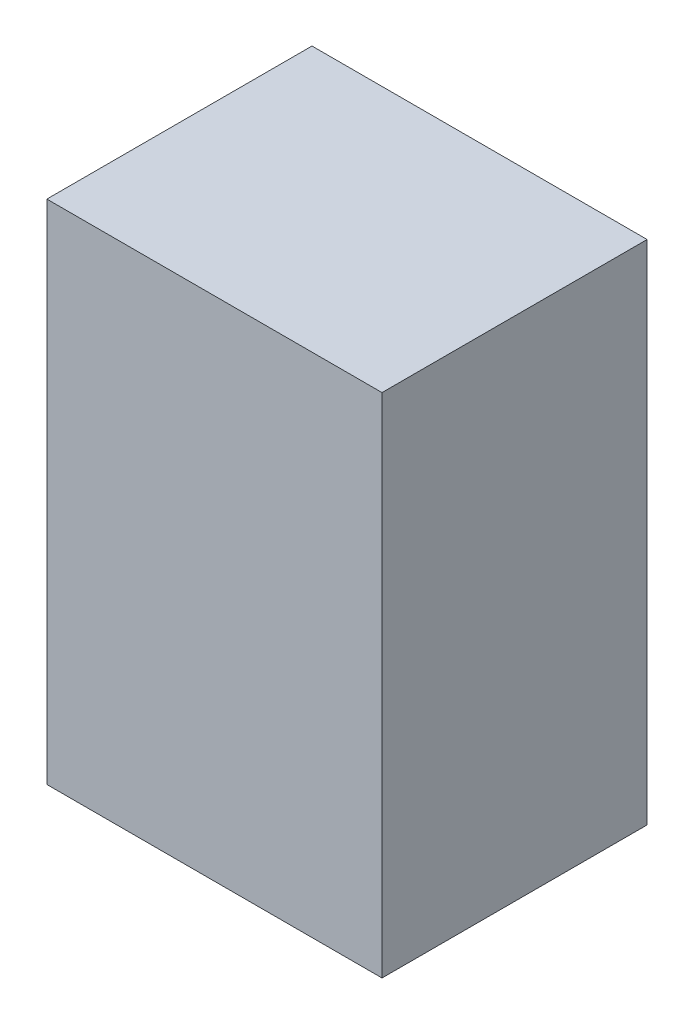
ISO-10303-21;
HEADER;
FILE_DESCRIPTION(('STEP AP214'),'2;1');
FILE_NAME('part.step','',(''),(''),'','','');
FILE_SCHEMA(('AUTOMOTIVE_DESIGN { 1 0 10303 214 1 1 1 1 }'));
ENDSEC;
DATA;
#1=APPLICATION_CONTEXT('core data for automotive mechanical design processes');
#2=APPLICATION_PROTOCOL_DEFINITION('international standard','automotive_design',2000,#1);
#3=PRODUCT_CONTEXT('',#1,'mechanical');
#4=PRODUCT('Part','Part','',(#3));
#5=PRODUCT_RELATED_PRODUCT_CATEGORY('part','',(#4));
#6=PRODUCT_DEFINITION_FORMATION('','',#4);
#7=PRODUCT_DEFINITION_CONTEXT('part definition',#1,'design');
#8=PRODUCT_DEFINITION('design','',#6,#7);
#9=PRODUCT_DEFINITION_SHAPE('','',#8);
#10=(LENGTH_UNIT() NAMED_UNIT(*) SI_UNIT(.MILLI.,.METRE.));
#11=(NAMED_UNIT(*) PLANE_ANGLE_UNIT() SI_UNIT($,.RADIAN.));
#12=(NAMED_UNIT(*) SI_UNIT($,.STERADIAN.) SOLID_ANGLE_UNIT());
#13=UNCERTAINTY_MEASURE_WITH_UNIT(LENGTH_MEASURE(1.E-05),#10,'distance_accuracy_value','');
#14=(GEOMETRIC_REPRESENTATION_CONTEXT(3) GLOBAL_UNCERTAINTY_ASSIGNED_CONTEXT((#13)) GLOBAL_UNIT_ASSIGNED_CONTEXT((#10,
#11,#12)) REPRESENTATION_CONTEXT('',''));
#15=CARTESIAN_POINT('',(0.,0.,0.));
#16=DIRECTION('',(0.,0.,1.));
#17=DIRECTION('',(1.,0.,0.));
#18=AXIS2_PLACEMENT_3D('',#15,#16,#17);
#19=CARTESIAN_POINT('',(-55.9097410810829,100.,-46.2077565993655));
#20=DIRECTION('',(1.,0.,0.));
#21=DIRECTION('',(0.,0.,-1.));
#22=AXIS2_PLACEMENT_3D('',#19,#20,#21);
#23=PLANE('',#22);
#24=DIRECTION('',(0.,0.,1.));
#25=VECTOR('',#24,1.);
#26=CARTESIAN_POINT('',(-55.9097410810829,0.,-46.2077565993655));
#27=LINE('',#26,#25);
#28=CARTESIAN_POINT('',(-55.9097410810829,0.,-46.2077565993655));
#29=VERTEX_POINT('',#28);
#30=CARTESIAN_POINT('',(-55.9097410810829,0.,6.08429535294137));
#31=VERTEX_POINT('',#30);
#32=EDGE_CURVE('E102',#29,#31,#27,.T.);
#33=ORIENTED_EDGE('',*,*,#32,.T.);
#34=DIRECTION('',(0.,-1.,0.));
#35=VECTOR('',#34,1.);
#36=CARTESIAN_POINT('',(-55.9097410810829,100.,6.08429535294137));
#37=LINE('',#36,#35);
#38=CARTESIAN_POINT('',(-55.9097410810829,100.,6.08429535294137));
#39=VERTEX_POINT('',#38);
#40=EDGE_CURVE('E11',#39,#31,#37,.T.);
#41=ORIENTED_EDGE('',*,*,#40,.F.);
#42=DIRECTION('',(0.,0.,1.));
#43=VECTOR('',#42,1.);
#44=CARTESIAN_POINT('',(-55.9097410810829,100.,-46.2077565993655));
#45=LINE('',#44,#43);
#46=CARTESIAN_POINT('',(-55.9097410810829,100.,-46.2077565993655));
#47=VERTEX_POINT('',#46);
#48=EDGE_CURVE('E88',#47,#39,#45,.T.);
#49=ORIENTED_EDGE('',*,*,#48,.F.);
#50=DIRECTION('',(0.,-1.,0.));
#51=VECTOR('',#50,1.);
#52=CARTESIAN_POINT('',(-55.9097410810829,100.,-46.2077565993655));
#53=LINE('',#52,#51);
#54=EDGE_CURVE('E55',#47,#29,#53,.T.);
#55=ORIENTED_EDGE('',*,*,#54,.T.);
#56=EDGE_LOOP('',(#33,#41,#49,#55));
#57=FACE_BOUND('',#56,.T.);
#58=ADVANCED_FACE('F39',(#57),#23,.F.);
#59=CARTESIAN_POINT('',(-55.9097410810829,100.,6.08429535294137));
#60=DIRECTION('',(0.,0.,-1.));
#61=DIRECTION('',(-1.,0.,0.));
#62=AXIS2_PLACEMENT_3D('',#59,#60,#61);
#63=PLANE('',#62);
#64=DIRECTION('',(1.,0.,0.));
#65=VECTOR('',#64,1.);
#66=CARTESIAN_POINT('',(-55.9097410810829,0.,6.08429535294137));
#67=LINE('',#66,#65);
#68=CARTESIAN_POINT('',(10.1953057265504,0.,6.08429535294137));
#69=VERTEX_POINT('',#68);
#70=EDGE_CURVE('E93',#31,#69,#67,.T.);
#71=ORIENTED_EDGE('',*,*,#70,.T.);
#72=DIRECTION('',(0.,-1.,0.));
#73=VECTOR('',#72,1.);
#74=CARTESIAN_POINT('',(10.1953057265504,100.,6.08429535294137));
#75=LINE('',#74,#73);
#76=CARTESIAN_POINT('',(10.1953057265504,100.,6.08429535294137));
#77=VERTEX_POINT('',#76);
#78=EDGE_CURVE('E47',#77,#69,#75,.T.);
#79=ORIENTED_EDGE('',*,*,#78,.F.);
#80=DIRECTION('',(1.,0.,0.));
#81=VECTOR('',#80,1.);
#82=CARTESIAN_POINT('',(-55.9097410810829,100.,6.08429535294137));
#83=LINE('',#82,#81);
#84=EDGE_CURVE('E80',#39,#77,#83,.T.);
#85=ORIENTED_EDGE('',*,*,#84,.F.);
#86=ORIENTED_EDGE('',*,*,#40,.T.);
#87=EDGE_LOOP('',(#71,#79,#85,#86));
#88=FACE_BOUND('',#87,.T.);
#89=ADVANCED_FACE('F92',(#88),#63,.F.);
#90=CARTESIAN_POINT('',(10.1953057265504,100.,-46.2077565993655));
#91=DIRECTION('',(1.,0.,0.));
#92=DIRECTION('',(0.,0.,-1.));
#93=AXIS2_PLACEMENT_3D('',#90,#91,#92);
#94=PLANE('',#93);
#95=DIRECTION('',(0.,0.,1.));
#96=VECTOR('',#95,1.);
#97=CARTESIAN_POINT('',(10.1953057265504,0.,-46.2077565993655));
#98=LINE('',#97,#96);
#99=CARTESIAN_POINT('',(10.1953057265504,0.,-46.2077565993655));
#100=VERTEX_POINT('',#99);
#101=EDGE_CURVE('E105',#100,#69,#98,.T.);
#102=ORIENTED_EDGE('',*,*,#101,.F.);
#103=DIRECTION('',(0.,-1.,0.));
#104=VECTOR('',#103,1.);
#105=CARTESIAN_POINT('',(10.1953057265504,100.,-46.2077565993655));
#106=LINE('',#105,#104);
#107=CARTESIAN_POINT('',(10.1953057265504,100.,-46.2077565993655));
#108=VERTEX_POINT('',#107);
#109=EDGE_CURVE('E69',#108,#100,#106,.T.);
#110=ORIENTED_EDGE('',*,*,#109,.F.);
#111=DIRECTION('',(0.,0.,1.));
#112=VECTOR('',#111,1.);
#113=CARTESIAN_POINT('',(10.1953057265504,100.,-46.2077565993655));
#114=LINE('',#113,#112);
#115=EDGE_CURVE('E87',#108,#77,#114,.T.);
#116=ORIENTED_EDGE('',*,*,#115,.T.);
#117=ORIENTED_EDGE('',*,*,#78,.T.);
#118=EDGE_LOOP('',(#102,#110,#116,#117));
#119=FACE_BOUND('',#118,.T.);
#120=ADVANCED_FACE('F96',(#119),#94,.T.);
#121=CARTESIAN_POINT('',(-55.9097410810829,100.,-46.2077565993655));
#122=DIRECTION('',(0.,0.,-1.));
#123=DIRECTION('',(-1.,0.,0.));
#124=AXIS2_PLACEMENT_3D('',#121,#122,#123);
#125=PLANE('',#124);
#126=DIRECTION('',(1.,0.,0.));
#127=VECTOR('',#126,1.);
#128=CARTESIAN_POINT('',(-55.9097410810829,0.,-46.2077565993655));
#129=LINE('',#128,#127);
#130=EDGE_CURVE('E107',#29,#100,#129,.T.);
#131=ORIENTED_EDGE('',*,*,#130,.F.);
#132=ORIENTED_EDGE('',*,*,#54,.F.);
#133=DIRECTION('',(1.,0.,0.));
#134=VECTOR('',#133,1.);
#135=CARTESIAN_POINT('',(-55.9097410810829,100.,-46.2077565993655));
#136=LINE('',#135,#134);
#137=EDGE_CURVE('E97',#47,#108,#136,.T.);
#138=ORIENTED_EDGE('',*,*,#137,.T.);
#139=ORIENTED_EDGE('',*,*,#109,.T.);
#140=EDGE_LOOP('',(#131,#132,#138,#139));
#141=FACE_BOUND('',#140,.T.);
#142=ADVANCED_FACE('F113',(#141),#125,.T.);
#143=CARTESIAN_POINT('',(0.,100.,0.));
#144=DIRECTION('',(0.,1.,0.));
#145=DIRECTION('',(0.,0.,1.));
#146=AXIS2_PLACEMENT_3D('',#143,#144,#145);
#147=PLANE('',#146);
#148=ORIENTED_EDGE('',*,*,#48,.T.);
#149=ORIENTED_EDGE('',*,*,#84,.T.);
#150=ORIENTED_EDGE('',*,*,#115,.F.);
#151=ORIENTED_EDGE('',*,*,#137,.F.);
#152=EDGE_LOOP('',(#148,#149,#150,#151));
#153=FACE_BOUND('',#152,.T.);
#154=ADVANCED_FACE('F84',(#153),#147,.T.);
#155=CARTESIAN_POINT('',(0.,0.,0.));
#156=DIRECTION('',(0.,1.,0.));
#157=DIRECTION('',(0.,0.,1.));
#158=AXIS2_PLACEMENT_3D('',#155,#156,#157);
#159=PLANE('',#158);
#160=ORIENTED_EDGE('',*,*,#32,.F.);
#161=ORIENTED_EDGE('',*,*,#130,.T.);
#162=ORIENTED_EDGE('',*,*,#101,.T.);
#163=ORIENTED_EDGE('',*,*,#70,.F.);
#164=EDGE_LOOP('',(#160,#161,#162,#163));
#165=FACE_BOUND('',#164,.T.);
#166=ADVANCED_FACE('F112',(#165),#159,.F.);
#167=CLOSED_SHELL('',(#58,#89,#120,#142,#154,#166));
#168=MANIFOLD_SOLID_BREP('B2',#167);
#169=ADVANCED_BREP_SHAPE_REPRESENTATION('',(#18,#168),#14);
#170=SHAPE_DEFINITION_REPRESENTATION(#9,#169);
ENDSEC;
END-ISO-10303-21;
